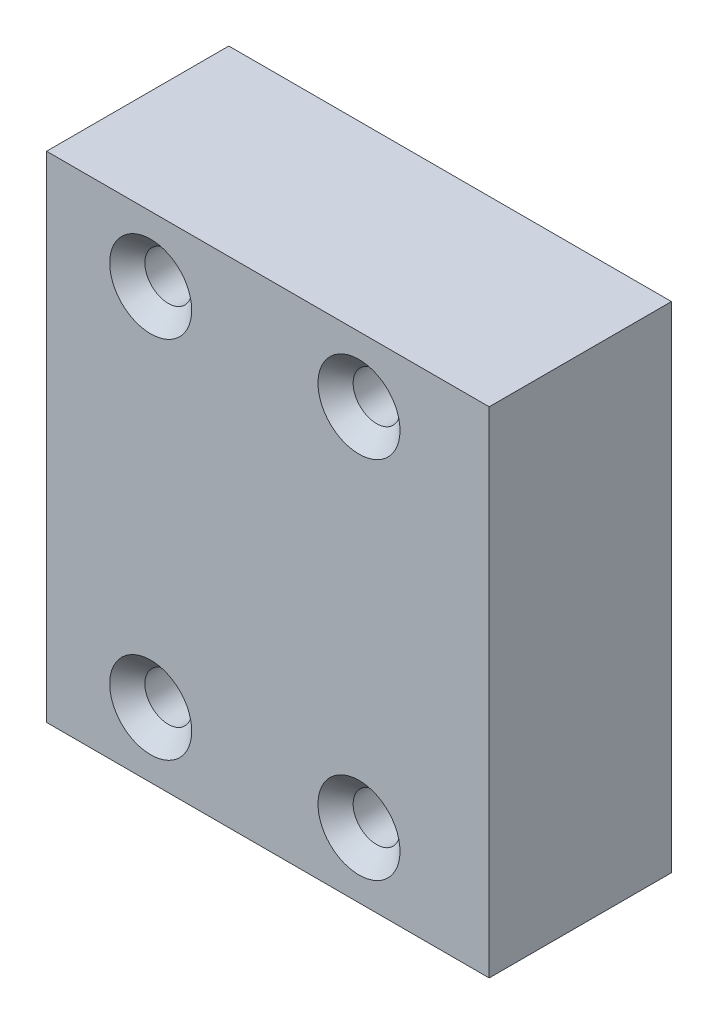
ISO-10303-21;
HEADER;
FILE_DESCRIPTION(('STEP AP214'),'2;1');
FILE_NAME('part.step','',(''),(''),'','','');
FILE_SCHEMA(('AUTOMOTIVE_DESIGN { 1 0 10303 214 1 1 1 1 }'));
ENDSEC;
DATA;
#1=APPLICATION_CONTEXT('core data for automotive mechanical design processes');
#2=APPLICATION_PROTOCOL_DEFINITION('international standard','automotive_design',2000,#1);
#3=PRODUCT_CONTEXT('',#1,'mechanical');
#4=PRODUCT('Part','Part','',(#3));
#5=PRODUCT_RELATED_PRODUCT_CATEGORY('part','',(#4));
#6=PRODUCT_DEFINITION_FORMATION('','',#4);
#7=PRODUCT_DEFINITION_CONTEXT('part definition',#1,'design');
#8=PRODUCT_DEFINITION('design','',#6,#7);
#9=PRODUCT_DEFINITION_SHAPE('','',#8);
#10=(LENGTH_UNIT() NAMED_UNIT(*) SI_UNIT(.MILLI.,.METRE.));
#11=(NAMED_UNIT(*) PLANE_ANGLE_UNIT() SI_UNIT($,.RADIAN.));
#12=(NAMED_UNIT(*) SI_UNIT($,.STERADIAN.) SOLID_ANGLE_UNIT());
#13=UNCERTAINTY_MEASURE_WITH_UNIT(LENGTH_MEASURE(1.E-05),#10,'distance_accuracy_value','');
#14=(GEOMETRIC_REPRESENTATION_CONTEXT(3) GLOBAL_UNCERTAINTY_ASSIGNED_CONTEXT((#13)) GLOBAL_UNIT_ASSIGNED_CONTEXT((#10,
#11,#12)) REPRESENTATION_CONTEXT('',''));
#15=CARTESIAN_POINT('',(0.,0.,0.));
#16=DIRECTION('',(0.,0.,1.));
#17=DIRECTION('',(1.,0.,0.));
#18=AXIS2_PLACEMENT_3D('',#15,#16,#17);
#19=CARTESIAN_POINT('',(-17.,-19.,14.));
#20=DIRECTION('',(1.,0.,0.));
#21=DIRECTION('',(0.,0.,-1.));
#22=AXIS2_PLACEMENT_3D('',#19,#20,#21);
#23=PLANE('',#22);
#24=DIRECTION('',(0.,-1.,0.));
#25=VECTOR('',#24,1.);
#26=CARTESIAN_POINT('',(-17.,-19.,0.));
#27=LINE('',#26,#25);
#28=CARTESIAN_POINT('',(-17.,19.,0.));
#29=VERTEX_POINT('',#28);
#30=CARTESIAN_POINT('',(-17.,-19.,0.));
#31=VERTEX_POINT('',#30);
#32=EDGE_CURVE('E96',#29,#31,#27,.T.);
#33=ORIENTED_EDGE('',*,*,#32,.T.);
#34=DIRECTION('',(0.,0.,-1.));
#35=VECTOR('',#34,1.);
#36=CARTESIAN_POINT('',(-17.,-19.,14.));
#37=LINE('',#36,#35);
#38=CARTESIAN_POINT('',(-17.,-19.,14.));
#39=VERTEX_POINT('',#38);
#40=EDGE_CURVE('E11',#39,#31,#37,.T.);
#41=ORIENTED_EDGE('',*,*,#40,.F.);
#42=DIRECTION('',(0.,-1.,0.));
#43=VECTOR('',#42,1.);
#44=CARTESIAN_POINT('',(-17.,-19.,14.));
#45=LINE('',#44,#43);
#46=CARTESIAN_POINT('',(-17.,19.,14.));
#47=VERTEX_POINT('',#46);
#48=EDGE_CURVE('E84',#47,#39,#45,.T.);
#49=ORIENTED_EDGE('',*,*,#48,.F.);
#50=DIRECTION('',(0.,0.,-1.));
#51=VECTOR('',#50,1.);
#52=CARTESIAN_POINT('',(-17.,19.,14.));
#53=LINE('',#52,#51);
#54=EDGE_CURVE('E92',#47,#29,#53,.T.);
#55=ORIENTED_EDGE('',*,*,#54,.T.);
#56=EDGE_LOOP('',(#33,#41,#49,#55));
#57=FACE_BOUND('',#56,.T.);
#58=ADVANCED_FACE('F33',(#57),#23,.F.);
#59=CARTESIAN_POINT('',(17.,-19.,14.));
#60=DIRECTION('',(0.,1.,0.));
#61=DIRECTION('',(-1.,0.,0.));
#62=AXIS2_PLACEMENT_3D('',#59,#60,#61);
#63=PLANE('',#62);
#64=DIRECTION('',(1.,0.,0.));
#65=VECTOR('',#64,1.);
#66=CARTESIAN_POINT('',(17.,-19.,0.));
#67=LINE('',#66,#65);
#68=CARTESIAN_POINT('',(17.,-19.,0.));
#69=VERTEX_POINT('',#68);
#70=EDGE_CURVE('E88',#31,#69,#67,.T.);
#71=ORIENTED_EDGE('',*,*,#70,.T.);
#72=DIRECTION('',(0.,0.,-1.));
#73=VECTOR('',#72,1.);
#74=CARTESIAN_POINT('',(17.,-19.,14.));
#75=LINE('',#74,#73);
#76=CARTESIAN_POINT('',(17.,-19.,14.));
#77=VERTEX_POINT('',#76);
#78=EDGE_CURVE('E41',#77,#69,#75,.T.);
#79=ORIENTED_EDGE('',*,*,#78,.F.);
#80=DIRECTION('',(1.,0.,0.));
#81=VECTOR('',#80,1.);
#82=CARTESIAN_POINT('',(17.,-19.,14.));
#83=LINE('',#82,#81);
#84=EDGE_CURVE('E79',#39,#77,#83,.T.);
#85=ORIENTED_EDGE('',*,*,#84,.F.);
#86=ORIENTED_EDGE('',*,*,#40,.T.);
#87=EDGE_LOOP('',(#71,#79,#85,#86));
#88=FACE_BOUND('',#87,.T.);
#89=ADVANCED_FACE('F87',(#88),#63,.F.);
#90=CARTESIAN_POINT('',(17.,-19.,14.));
#91=DIRECTION('',(-1.,0.,0.));
#92=DIRECTION('',(0.,0.,1.));
#93=AXIS2_PLACEMENT_3D('',#90,#91,#92);
#94=PLANE('',#93);
#95=DIRECTION('',(0.,1.,0.));
#96=VECTOR('',#95,1.);
#97=CARTESIAN_POINT('',(17.,-19.,0.));
#98=LINE('',#97,#96);
#99=CARTESIAN_POINT('',(17.,19.,0.));
#100=VERTEX_POINT('',#99);
#101=EDGE_CURVE('E66',#69,#100,#98,.T.);
#102=ORIENTED_EDGE('',*,*,#101,.T.);
#103=DIRECTION('',(0.,0.,-1.));
#104=VECTOR('',#103,1.);
#105=CARTESIAN_POINT('',(17.,19.,14.));
#106=LINE('',#105,#104);
#107=CARTESIAN_POINT('',(17.,19.,14.));
#108=VERTEX_POINT('',#107);
#109=EDGE_CURVE('E89',#108,#100,#106,.T.);
#110=ORIENTED_EDGE('',*,*,#109,.F.);
#111=DIRECTION('',(0.,1.,0.));
#112=VECTOR('',#111,1.);
#113=CARTESIAN_POINT('',(17.,-19.,14.));
#114=LINE('',#113,#112);
#115=EDGE_CURVE('E82',#77,#108,#114,.T.);
#116=ORIENTED_EDGE('',*,*,#115,.F.);
#117=ORIENTED_EDGE('',*,*,#78,.T.);
#118=EDGE_LOOP('',(#102,#110,#116,#117));
#119=FACE_BOUND('',#118,.T.);
#120=ADVANCED_FACE('F90',(#119),#94,.F.);
#121=CARTESIAN_POINT('',(17.,19.,14.));
#122=DIRECTION('',(0.,-1.,0.));
#123=DIRECTION('',(1.,0.,0.));
#124=AXIS2_PLACEMENT_3D('',#121,#122,#123);
#125=PLANE('',#124);
#126=DIRECTION('',(-1.,0.,0.));
#127=VECTOR('',#126,1.);
#128=CARTESIAN_POINT('',(17.,19.,0.));
#129=LINE('',#128,#127);
#130=EDGE_CURVE('E72',#100,#29,#129,.T.);
#131=ORIENTED_EDGE('',*,*,#130,.T.);
#132=ORIENTED_EDGE('',*,*,#54,.F.);
#133=DIRECTION('',(-1.,0.,0.));
#134=VECTOR('',#133,1.);
#135=CARTESIAN_POINT('',(17.,19.,14.));
#136=LINE('',#135,#134);
#137=EDGE_CURVE('E49',#108,#47,#136,.T.);
#138=ORIENTED_EDGE('',*,*,#137,.F.);
#139=ORIENTED_EDGE('',*,*,#109,.T.);
#140=EDGE_LOOP('',(#131,#132,#138,#139));
#141=FACE_BOUND('',#140,.T.);
#142=ADVANCED_FACE('F104',(#141),#125,.F.);
#143=CARTESIAN_POINT('',(0.,0.,14.));
#144=DIRECTION('',(0.,0.,1.));
#145=DIRECTION('',(1.,0.,0.));
#146=AXIS2_PLACEMENT_3D('',#143,#144,#145);
#147=PLANE('',#146);
#148=CARTESIAN_POINT('',(-8.99999999999999,14.,14.));
#149=DIRECTION('',(0.,0.,1.));
#150=DIRECTION('',(1.,0.,0.));
#151=AXIS2_PLACEMENT_3D('',#148,#149,#150);
#152=CIRCLE('',#151,3.15);
#153=CARTESIAN_POINT('',(-5.84999999999999,14.,14.));
#154=VERTEX_POINT('',#153);
#155=EDGE_CURVE('E142',#154,#154,#152,.T.);
#156=ORIENTED_EDGE('',*,*,#155,.F.);
#157=EDGE_LOOP('',(#156));
#158=FACE_BOUND('',#157,.T.);
#159=CARTESIAN_POINT('',(-8.99999999999999,-14.,14.));
#160=DIRECTION('',(0.,0.,1.));
#161=DIRECTION('',(1.,0.,0.));
#162=AXIS2_PLACEMENT_3D('',#159,#160,#161);
#163=CIRCLE('',#162,3.15);
#164=CARTESIAN_POINT('',(-5.84999999999999,-14.,14.));
#165=VERTEX_POINT('',#164);
#166=EDGE_CURVE('E133',#165,#165,#163,.T.);
#167=ORIENTED_EDGE('',*,*,#166,.F.);
#168=EDGE_LOOP('',(#167));
#169=FACE_BOUND('',#168,.T.);
#170=CARTESIAN_POINT('',(7.00000000000001,-14.,14.));
#171=DIRECTION('',(0.,0.,1.));
#172=DIRECTION('',(1.,0.,0.));
#173=AXIS2_PLACEMENT_3D('',#170,#171,#172);
#174=CIRCLE('',#173,3.15);
#175=CARTESIAN_POINT('',(10.15,-14.,14.));
#176=VERTEX_POINT('',#175);
#177=EDGE_CURVE('E124',#176,#176,#174,.T.);
#178=ORIENTED_EDGE('',*,*,#177,.F.);
#179=EDGE_LOOP('',(#178));
#180=FACE_BOUND('',#179,.T.);
#181=CARTESIAN_POINT('',(7.00000000000001,14.,14.));
#182=DIRECTION('',(0.,0.,1.));
#183=DIRECTION('',(1.,0.,0.));
#184=AXIS2_PLACEMENT_3D('',#181,#182,#183);
#185=CIRCLE('',#184,3.15);
#186=CARTESIAN_POINT('',(10.15,14.,14.));
#187=VERTEX_POINT('',#186);
#188=EDGE_CURVE('E115',#187,#187,#185,.T.);
#189=ORIENTED_EDGE('',*,*,#188,.F.);
#190=EDGE_LOOP('',(#189));
#191=FACE_BOUND('',#190,.T.);
#192=ORIENTED_EDGE('',*,*,#48,.T.);
#193=ORIENTED_EDGE('',*,*,#84,.T.);
#194=ORIENTED_EDGE('',*,*,#115,.T.);
#195=ORIENTED_EDGE('',*,*,#137,.T.);
#196=EDGE_LOOP('',(#192,#193,#194,#195));
#197=FACE_BOUND('',#196,.T.);
#198=ADVANCED_FACE('F80',(#158,#169,#180,#191,#197),#147,.T.);
#199=CARTESIAN_POINT('',(0.,0.,0.));
#200=DIRECTION('',(0.,0.,1.));
#201=DIRECTION('',(1.,0.,0.));
#202=AXIS2_PLACEMENT_3D('',#199,#200,#201);
#203=PLANE('',#202);
#204=CARTESIAN_POINT('',(-8.99999999999999,14.,0.));
#205=DIRECTION('',(0.,0.,1.));
#206=DIRECTION('',(1.,0.,0.));
#207=AXIS2_PLACEMENT_3D('',#204,#205,#206);
#208=CIRCLE('',#207,1.8);
#209=CARTESIAN_POINT('',(-7.19999999999999,14.,0.));
#210=VERTEX_POINT('',#209);
#211=EDGE_CURVE('E136',#210,#210,#208,.T.);
#212=ORIENTED_EDGE('',*,*,#211,.T.);
#213=EDGE_LOOP('',(#212));
#214=FACE_BOUND('',#213,.T.);
#215=CARTESIAN_POINT('',(-8.99999999999999,-14.,0.));
#216=DIRECTION('',(0.,0.,1.));
#217=DIRECTION('',(1.,0.,0.));
#218=AXIS2_PLACEMENT_3D('',#215,#216,#217);
#219=CIRCLE('',#218,1.8);
#220=CARTESIAN_POINT('',(-7.19999999999999,-14.,0.));
#221=VERTEX_POINT('',#220);
#222=EDGE_CURVE('E127',#221,#221,#219,.T.);
#223=ORIENTED_EDGE('',*,*,#222,.T.);
#224=EDGE_LOOP('',(#223));
#225=FACE_BOUND('',#224,.T.);
#226=CARTESIAN_POINT('',(7.00000000000001,-14.,0.));
#227=DIRECTION('',(0.,0.,1.));
#228=DIRECTION('',(1.,0.,0.));
#229=AXIS2_PLACEMENT_3D('',#226,#227,#228);
#230=CIRCLE('',#229,1.8);
#231=CARTESIAN_POINT('',(8.80000000000001,-14.,0.));
#232=VERTEX_POINT('',#231);
#233=EDGE_CURVE('E118',#232,#232,#230,.T.);
#234=ORIENTED_EDGE('',*,*,#233,.T.);
#235=EDGE_LOOP('',(#234));
#236=FACE_BOUND('',#235,.T.);
#237=CARTESIAN_POINT('',(7.00000000000001,14.,0.));
#238=DIRECTION('',(0.,0.,1.));
#239=DIRECTION('',(1.,0.,0.));
#240=AXIS2_PLACEMENT_3D('',#237,#238,#239);
#241=CIRCLE('',#240,1.8);
#242=CARTESIAN_POINT('',(8.80000000000001,14.,0.));
#243=VERTEX_POINT('',#242);
#244=EDGE_CURVE('E99',#243,#243,#241,.T.);
#245=ORIENTED_EDGE('',*,*,#244,.T.);
#246=EDGE_LOOP('',(#245));
#247=FACE_BOUND('',#246,.T.);
#248=ORIENTED_EDGE('',*,*,#32,.F.);
#249=ORIENTED_EDGE('',*,*,#130,.F.);
#250=ORIENTED_EDGE('',*,*,#101,.F.);
#251=ORIENTED_EDGE('',*,*,#70,.F.);
#252=EDGE_LOOP('',(#248,#249,#250,#251));
#253=FACE_BOUND('',#252,.T.);
#254=ADVANCED_FACE('F107',(#214,#225,#236,#247,#253),#203,.F.);
#255=CARTESIAN_POINT('',(7.00000000000001,14.,14.));
#256=DIRECTION('',(0.,0.,1.));
#257=DIRECTION('',(1.,0.,0.));
#258=AXIS2_PLACEMENT_3D('',#255,#256,#257);
#259=CYLINDRICAL_SURFACE('',#258,1.79999999999999);
#260=ORIENTED_EDGE('',*,*,#244,.F.);
#261=EDGE_LOOP('',(#260));
#262=FACE_BOUND('',#261,.T.);
#263=CARTESIAN_POINT('',(7.00000000000001,14.,12.65));
#264=DIRECTION('',(0.,0.,1.));
#265=DIRECTION('',(1.,0.,0.));
#266=AXIS2_PLACEMENT_3D('',#263,#264,#265);
#267=CIRCLE('',#266,1.79999999999999);
#268=CARTESIAN_POINT('',(8.8,14.,12.65));
#269=VERTEX_POINT('',#268);
#270=EDGE_CURVE('E112',#269,#269,#267,.T.);
#271=ORIENTED_EDGE('',*,*,#270,.T.);
#272=EDGE_LOOP('',(#271));
#273=FACE_BOUND('',#272,.T.);
#274=ADVANCED_FACE('F160',(#262,#273),#259,.F.);
#275=CARTESIAN_POINT('',(7.00000000000001,14.,14.));
#276=DIRECTION('',(0.,0.,1.));
#277=DIRECTION('',(1.,0.,0.));
#278=AXIS2_PLACEMENT_3D('',#275,#276,#277);
#279=CONICAL_SURFACE('',#278,3.15,0.785398163397451);
#280=ORIENTED_EDGE('',*,*,#270,.F.);
#281=EDGE_LOOP('',(#280));
#282=FACE_BOUND('',#281,.T.);
#283=ORIENTED_EDGE('',*,*,#188,.T.);
#284=EDGE_LOOP('',(#283));
#285=FACE_BOUND('',#284,.T.);
#286=ADVANCED_FACE('F157',(#282,#285),#279,.F.);
#287=CARTESIAN_POINT('',(7.00000000000001,-14.,14.));
#288=DIRECTION('',(0.,0.,1.));
#289=DIRECTION('',(1.,0.,0.));
#290=AXIS2_PLACEMENT_3D('',#287,#288,#289);
#291=CYLINDRICAL_SURFACE('',#290,1.79999999999999);
#292=ORIENTED_EDGE('',*,*,#233,.F.);
#293=EDGE_LOOP('',(#292));
#294=FACE_BOUND('',#293,.T.);
#295=CARTESIAN_POINT('',(7.00000000000001,-14.,12.65));
#296=DIRECTION('',(0.,0.,1.));
#297=DIRECTION('',(1.,0.,0.));
#298=AXIS2_PLACEMENT_3D('',#295,#296,#297);
#299=CIRCLE('',#298,1.79999999999999);
#300=CARTESIAN_POINT('',(8.8,-14.,12.65));
#301=VERTEX_POINT('',#300);
#302=EDGE_CURVE('E121',#301,#301,#299,.T.);
#303=ORIENTED_EDGE('',*,*,#302,.T.);
#304=EDGE_LOOP('',(#303));
#305=FACE_BOUND('',#304,.T.);
#306=ADVANCED_FACE('F159',(#294,#305),#291,.F.);
#307=CARTESIAN_POINT('',(7.00000000000001,-14.,14.));
#308=DIRECTION('',(0.,0.,1.));
#309=DIRECTION('',(1.,0.,0.));
#310=AXIS2_PLACEMENT_3D('',#307,#308,#309);
#311=CONICAL_SURFACE('',#310,3.15,0.785398163397451);
#312=ORIENTED_EDGE('',*,*,#302,.F.);
#313=EDGE_LOOP('',(#312));
#314=FACE_BOUND('',#313,.T.);
#315=ORIENTED_EDGE('',*,*,#177,.T.);
#316=EDGE_LOOP('',(#315));
#317=FACE_BOUND('',#316,.T.);
#318=ADVANCED_FACE('F167',(#314,#317),#311,.F.);
#319=CARTESIAN_POINT('',(-8.99999999999999,-14.,14.));
#320=DIRECTION('',(0.,0.,1.));
#321=DIRECTION('',(1.,0.,0.));
#322=AXIS2_PLACEMENT_3D('',#319,#320,#321);
#323=CYLINDRICAL_SURFACE('',#322,1.79999999999999);
#324=ORIENTED_EDGE('',*,*,#222,.F.);
#325=EDGE_LOOP('',(#324));
#326=FACE_BOUND('',#325,.T.);
#327=CARTESIAN_POINT('',(-8.99999999999999,-14.,12.65));
#328=DIRECTION('',(0.,0.,1.));
#329=DIRECTION('',(1.,0.,0.));
#330=AXIS2_PLACEMENT_3D('',#327,#328,#329);
#331=CIRCLE('',#330,1.79999999999999);
#332=CARTESIAN_POINT('',(-7.2,-14.,12.65));
#333=VERTEX_POINT('',#332);
#334=EDGE_CURVE('E130',#333,#333,#331,.T.);
#335=ORIENTED_EDGE('',*,*,#334,.T.);
#336=EDGE_LOOP('',(#335));
#337=FACE_BOUND('',#336,.T.);
#338=ADVANCED_FACE('F201',(#326,#337),#323,.F.);
#339=CARTESIAN_POINT('',(-8.99999999999999,-14.,14.));
#340=DIRECTION('',(0.,0.,1.));
#341=DIRECTION('',(1.,0.,0.));
#342=AXIS2_PLACEMENT_3D('',#339,#340,#341);
#343=CONICAL_SURFACE('',#342,3.15,0.785398163397451);
#344=ORIENTED_EDGE('',*,*,#334,.F.);
#345=EDGE_LOOP('',(#344));
#346=FACE_BOUND('',#345,.T.);
#347=ORIENTED_EDGE('',*,*,#166,.T.);
#348=EDGE_LOOP('',(#347));
#349=FACE_BOUND('',#348,.T.);
#350=ADVANCED_FACE('F206',(#346,#349),#343,.F.);
#351=CARTESIAN_POINT('',(-8.99999999999999,14.,14.));
#352=DIRECTION('',(0.,0.,1.));
#353=DIRECTION('',(1.,0.,0.));
#354=AXIS2_PLACEMENT_3D('',#351,#352,#353);
#355=CYLINDRICAL_SURFACE('',#354,1.79999999999999);
#356=ORIENTED_EDGE('',*,*,#211,.F.);
#357=EDGE_LOOP('',(#356));
#358=FACE_BOUND('',#357,.T.);
#359=CARTESIAN_POINT('',(-8.99999999999999,14.,12.65));
#360=DIRECTION('',(0.,0.,1.));
#361=DIRECTION('',(1.,0.,0.));
#362=AXIS2_PLACEMENT_3D('',#359,#360,#361);
#363=CIRCLE('',#362,1.79999999999999);
#364=CARTESIAN_POINT('',(-7.2,14.,12.65));
#365=VERTEX_POINT('',#364);
#366=EDGE_CURVE('E139',#365,#365,#363,.T.);
#367=ORIENTED_EDGE('',*,*,#366,.T.);
#368=EDGE_LOOP('',(#367));
#369=FACE_BOUND('',#368,.T.);
#370=ADVANCED_FACE('F212',(#358,#369),#355,.F.);
#371=CARTESIAN_POINT('',(-8.99999999999999,14.,14.));
#372=DIRECTION('',(0.,0.,1.));
#373=DIRECTION('',(1.,0.,0.));
#374=AXIS2_PLACEMENT_3D('',#371,#372,#373);
#375=CONICAL_SURFACE('',#374,3.15,0.785398163397451);
#376=ORIENTED_EDGE('',*,*,#366,.F.);
#377=EDGE_LOOP('',(#376));
#378=FACE_BOUND('',#377,.T.);
#379=ORIENTED_EDGE('',*,*,#155,.T.);
#380=EDGE_LOOP('',(#379));
#381=FACE_BOUND('',#380,.T.);
#382=ADVANCED_FACE('F146',(#378,#381),#375,.F.);
#383=CLOSED_SHELL('',(#58,#89,#120,#142,#198,#254,#274,#286,#306,#318,#338,#350,#370,#382));
#384=MANIFOLD_SOLID_BREP('B2',#383);
#385=ADVANCED_BREP_SHAPE_REPRESENTATION('',(#18,#384),#14);
#386=SHAPE_DEFINITION_REPRESENTATION(#9,#385);
ENDSEC;
END-ISO-10303-21;
